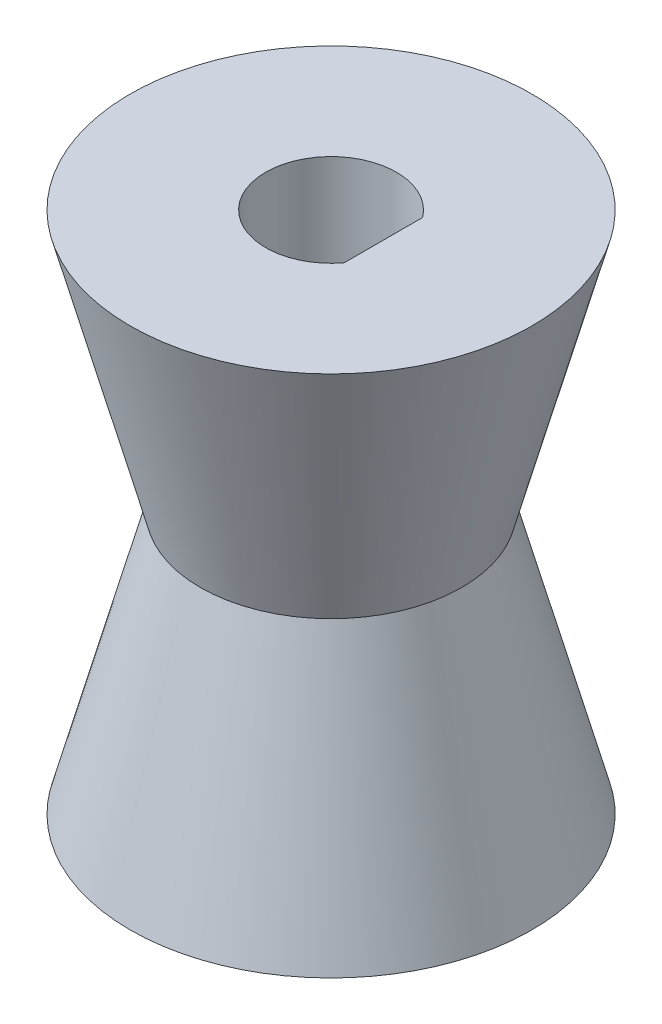
ISO-10303-21;
HEADER;
FILE_DESCRIPTION(('STEP AP214'),'2;1');
FILE_NAME('part.step','',(''),(''),'','','');
FILE_SCHEMA(('AUTOMOTIVE_DESIGN { 1 0 10303 214 1 1 1 1 }'));
ENDSEC;
DATA;
#1=APPLICATION_CONTEXT('core data for automotive mechanical design processes');
#2=APPLICATION_PROTOCOL_DEFINITION('international standard','automotive_design',2000,#1);
#3=PRODUCT_CONTEXT('',#1,'mechanical');
#4=PRODUCT('Part','Part','',(#3));
#5=PRODUCT_RELATED_PRODUCT_CATEGORY('part','',(#4));
#6=PRODUCT_DEFINITION_FORMATION('','',#4);
#7=PRODUCT_DEFINITION_CONTEXT('part definition',#1,'design');
#8=PRODUCT_DEFINITION('design','',#6,#7);
#9=PRODUCT_DEFINITION_SHAPE('','',#8);
#10=(LENGTH_UNIT() NAMED_UNIT(*) SI_UNIT(.MILLI.,.METRE.));
#11=(NAMED_UNIT(*) PLANE_ANGLE_UNIT() SI_UNIT($,.RADIAN.));
#12=(NAMED_UNIT(*) SI_UNIT($,.STERADIAN.) SOLID_ANGLE_UNIT());
#13=UNCERTAINTY_MEASURE_WITH_UNIT(LENGTH_MEASURE(1.E-05),#10,'distance_accuracy_value','');
#14=(GEOMETRIC_REPRESENTATION_CONTEXT(3) GLOBAL_UNCERTAINTY_ASSIGNED_CONTEXT((#13)) GLOBAL_UNIT_ASSIGNED_CONTEXT((#10,
#11,#12)) REPRESENTATION_CONTEXT('',''));
#15=CARTESIAN_POINT('',(0.,0.,0.));
#16=DIRECTION('',(0.,0.,1.));
#17=DIRECTION('',(1.,0.,0.));
#18=AXIS2_PLACEMENT_3D('',#15,#16,#17);
#19=CARTESIAN_POINT('',(0.,0.,0.));
#20=DIRECTION('',(0.,1.,0.));
#21=DIRECTION('',(0.,0.,1.));
#22=AXIS2_PLACEMENT_3D('',#19,#20,#21);
#23=PLANE('',#22);
#24=CARTESIAN_POINT('',(0.,0.,0.));
#25=DIRECTION('',(0.,1.,0.));
#26=DIRECTION('',(0.,0.,1.));
#27=AXIS2_PLACEMENT_3D('',#24,#25,#26);
#28=CIRCLE('',#27,7.67949192431123);
#29=CARTESIAN_POINT('',(0.,0.,7.67949192431123));
#30=VERTEX_POINT('',#29);
#31=EDGE_CURVE('E35',#30,#30,#28,.T.);
#32=ORIENTED_EDGE('',*,*,#31,.F.);
#33=EDGE_LOOP('',(#32));
#34=FACE_BOUND('',#33,.T.);
#35=CARTESIAN_POINT('',(0.,0.,0.));
#36=DIRECTION('',(0.,1.,0.));
#37=DIRECTION('',(0.,0.,1.));
#38=AXIS2_PLACEMENT_3D('',#35,#36,#37);
#39=CIRCLE('',#38,2.5);
#40=CARTESIAN_POINT('',(2.,0.,-1.5));
#41=VERTEX_POINT('',#40);
#42=CARTESIAN_POINT('',(2.,0.,1.5));
#43=VERTEX_POINT('',#42);
#44=EDGE_CURVE('E46',#41,#43,#39,.T.);
#45=ORIENTED_EDGE('',*,*,#44,.T.);
#46=DIRECTION('',(0.,0.,-1.));
#47=VECTOR('',#46,1.);
#48=CARTESIAN_POINT('',(2.,0.,-1.5));
#49=LINE('',#48,#47);
#50=EDGE_CURVE('E53',#43,#41,#49,.T.);
#51=ORIENTED_EDGE('',*,*,#50,.T.);
#52=EDGE_LOOP('',(#45,#51));
#53=FACE_BOUND('',#52,.T.);
#54=ADVANCED_FACE('F31',(#34,#53),#23,.F.);
#55=CARTESIAN_POINT('',(0.,10.,0.));
#56=DIRECTION('',(0.,-1.,0.));
#57=DIRECTION('',(0.,0.,1.));
#58=AXIS2_PLACEMENT_3D('',#55,#56,#57);
#59=CONICAL_SURFACE('',#58,5.,0.261799387799149);
#60=CARTESIAN_POINT('',(0.,10.,0.));
#61=DIRECTION('',(0.,1.,0.));
#62=DIRECTION('',(0.,0.,1.));
#63=AXIS2_PLACEMENT_3D('',#60,#61,#62);
#64=CIRCLE('',#63,5.);
#65=CARTESIAN_POINT('',(0.,10.,5.));
#66=VERTEX_POINT('',#65);
#67=EDGE_CURVE('E11',#66,#66,#64,.T.);
#68=ORIENTED_EDGE('',*,*,#67,.F.);
#69=EDGE_LOOP('',(#68));
#70=FACE_BOUND('',#69,.T.);
#71=ORIENTED_EDGE('',*,*,#31,.T.);
#72=EDGE_LOOP('',(#71));
#73=FACE_BOUND('',#72,.T.);
#74=ADVANCED_FACE('F81',(#70,#73),#59,.T.);
#75=CARTESIAN_POINT('',(0.,10.,0.));
#76=DIRECTION('',(0.,-1.,0.));
#77=DIRECTION('',(0.,0.,-1.));
#78=AXIS2_PLACEMENT_3D('',#75,#76,#77);
#79=CYLINDRICAL_SURFACE('',#78,2.5);
#80=ORIENTED_EDGE('',*,*,#44,.F.);
#81=DIRECTION('',(0.,-1.,0.));
#82=VECTOR('',#81,1.);
#83=CARTESIAN_POINT('',(2.,10.,-1.5));
#84=LINE('',#83,#82);
#85=CARTESIAN_POINT('',(2.,20.,-1.5));
#86=VERTEX_POINT('',#85);
#87=EDGE_CURVE('E58',#86,#41,#84,.T.);
#88=ORIENTED_EDGE('',*,*,#87,.F.);
#89=CARTESIAN_POINT('',(0.,20.,0.));
#90=DIRECTION('',(0.,1.,0.));
#91=DIRECTION('',(0.,0.,1.));
#92=AXIS2_PLACEMENT_3D('',#89,#90,#91);
#93=CIRCLE('',#92,2.5);
#94=CARTESIAN_POINT('',(2.,20.,1.5));
#95=VERTEX_POINT('',#94);
#96=EDGE_CURVE('E62',#86,#95,#93,.T.);
#97=ORIENTED_EDGE('',*,*,#96,.T.);
#98=DIRECTION('',(0.,-1.,0.));
#99=VECTOR('',#98,1.);
#100=CARTESIAN_POINT('',(2.,10.,1.5));
#101=LINE('',#100,#99);
#102=EDGE_CURVE('E64',#95,#43,#101,.T.);
#103=ORIENTED_EDGE('',*,*,#102,.T.);
#104=EDGE_LOOP('',(#80,#88,#97,#103));
#105=FACE_BOUND('',#104,.T.);
#106=ADVANCED_FACE('F60',(#105),#79,.F.);
#107=CARTESIAN_POINT('',(2.,10.,-1.5));
#108=DIRECTION('',(-1.,0.,0.));
#109=DIRECTION('',(0.,0.,1.));
#110=AXIS2_PLACEMENT_3D('',#107,#108,#109);
#111=PLANE('',#110);
#112=ORIENTED_EDGE('',*,*,#50,.F.);
#113=ORIENTED_EDGE('',*,*,#102,.F.);
#114=DIRECTION('',(0.,0.,-1.));
#115=VECTOR('',#114,1.);
#116=CARTESIAN_POINT('',(2.,20.,-1.5));
#117=LINE('',#116,#115);
#118=EDGE_CURVE('E66',#95,#86,#117,.T.);
#119=ORIENTED_EDGE('',*,*,#118,.T.);
#120=ORIENTED_EDGE('',*,*,#87,.T.);
#121=EDGE_LOOP('',(#112,#113,#119,#120));
#122=FACE_BOUND('',#121,.T.);
#123=ADVANCED_FACE('F67',(#122),#111,.T.);
#124=CARTESIAN_POINT('',(0.,20.,0.));
#125=DIRECTION('',(0.,1.,0.));
#126=DIRECTION('',(0.,0.,1.));
#127=AXIS2_PLACEMENT_3D('',#124,#125,#126);
#128=PLANE('',#127);
#129=CARTESIAN_POINT('',(0.,20.,0.));
#130=DIRECTION('',(0.,1.,0.));
#131=DIRECTION('',(0.,0.,1.));
#132=AXIS2_PLACEMENT_3D('',#129,#130,#131);
#133=CIRCLE('',#132,7.67949192431123);
#134=CARTESIAN_POINT('',(0.,20.,7.67949192431123));
#135=VERTEX_POINT('',#134);
#136=EDGE_CURVE('E69',#135,#135,#133,.T.);
#137=ORIENTED_EDGE('',*,*,#136,.T.);
#138=EDGE_LOOP('',(#137));
#139=FACE_BOUND('',#138,.T.);
#140=ORIENTED_EDGE('',*,*,#118,.F.);
#141=ORIENTED_EDGE('',*,*,#96,.F.);
#142=EDGE_LOOP('',(#140,#141));
#143=FACE_BOUND('',#142,.T.);
#144=ADVANCED_FACE('F71',(#139,#143),#128,.T.);
#145=CARTESIAN_POINT('',(0.,20.,0.));
#146=DIRECTION('',(0.,1.,0.));
#147=DIRECTION('',(0.,0.,1.));
#148=AXIS2_PLACEMENT_3D('',#145,#146,#147);
#149=CONICAL_SURFACE('',#148,7.67949192431123,0.26179938779915);
#150=ORIENTED_EDGE('',*,*,#136,.F.);
#151=EDGE_LOOP('',(#150));
#152=FACE_BOUND('',#151,.T.);
#153=ORIENTED_EDGE('',*,*,#67,.T.);
#154=EDGE_LOOP('',(#153));
#155=FACE_BOUND('',#154,.T.);
#156=ADVANCED_FACE('F33',(#152,#155),#149,.T.);
#157=CLOSED_SHELL('',(#54,#74,#106,#123,#144,#156));
#158=MANIFOLD_SOLID_BREP('B2',#157);
#159=ADVANCED_BREP_SHAPE_REPRESENTATION('',(#18,#158),#14);
#160=SHAPE_DEFINITION_REPRESENTATION(#9,#159);
ENDSEC;
END-ISO-10303-21;
